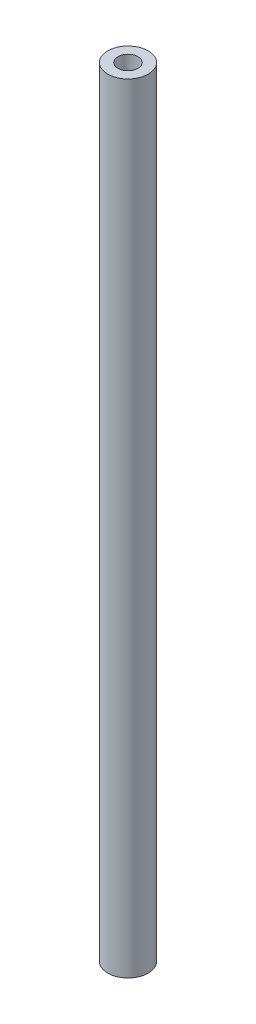
ISO-10303-21;
HEADER;
FILE_DESCRIPTION(('STEP AP214'),'2;1');
FILE_NAME('part.step','',(''),(''),'','','');
FILE_SCHEMA(('AUTOMOTIVE_DESIGN { 1 0 10303 214 1 1 1 1 }'));
ENDSEC;
DATA;
#1=APPLICATION_CONTEXT('core data for automotive mechanical design processes');
#2=APPLICATION_PROTOCOL_DEFINITION('international standard','automotive_design',2000,#1);
#3=PRODUCT_CONTEXT('',#1,'mechanical');
#4=PRODUCT('Part','Part','',(#3));
#5=PRODUCT_RELATED_PRODUCT_CATEGORY('part','',(#4));
#6=PRODUCT_DEFINITION_FORMATION('','',#4);
#7=PRODUCT_DEFINITION_CONTEXT('part definition',#1,'design');
#8=PRODUCT_DEFINITION('design','',#6,#7);
#9=PRODUCT_DEFINITION_SHAPE('','',#8);
#10=(LENGTH_UNIT() NAMED_UNIT(*) SI_UNIT(.MILLI.,.METRE.));
#11=(NAMED_UNIT(*) PLANE_ANGLE_UNIT() SI_UNIT($,.RADIAN.));
#12=(NAMED_UNIT(*) SI_UNIT($,.STERADIAN.) SOLID_ANGLE_UNIT());
#13=UNCERTAINTY_MEASURE_WITH_UNIT(LENGTH_MEASURE(1.E-05),#10,'distance_accuracy_value','');
#14=(GEOMETRIC_REPRESENTATION_CONTEXT(3) GLOBAL_UNCERTAINTY_ASSIGNED_CONTEXT((#13)) GLOBAL_UNIT_ASSIGNED_CONTEXT((#10,
#11,#12)) REPRESENTATION_CONTEXT('',''));
#15=CARTESIAN_POINT('',(0.,0.,0.));
#16=DIRECTION('',(0.,0.,1.));
#17=DIRECTION('',(1.,0.,0.));
#18=AXIS2_PLACEMENT_3D('',#15,#16,#17);
#19=CARTESIAN_POINT('',(0.,367.03,0.));
#20=DIRECTION('',(0.,1.,0.));
#21=DIRECTION('',(0.,0.,1.));
#22=AXIS2_PLACEMENT_3D('',#19,#20,#21);
#23=PLANE('',#22);
#24=CARTESIAN_POINT('',(0.,367.03,0.));
#25=DIRECTION('',(0.,1.,0.));
#26=DIRECTION('',(0.,0.,1.));
#27=AXIS2_PLACEMENT_3D('',#24,#25,#26);
#28=CIRCLE('',#27,9.525);
#29=CARTESIAN_POINT('',(0.,367.03,9.525));
#30=VERTEX_POINT('',#29);
#31=EDGE_CURVE('E10',#30,#30,#28,.T.);
#32=ORIENTED_EDGE('',*,*,#31,.T.);
#33=EDGE_LOOP('',(#32));
#34=FACE_BOUND('',#33,.T.);
#35=CARTESIAN_POINT('',(0.,367.03,0.));
#36=DIRECTION('',(0.,1.,0.));
#37=DIRECTION('',(0.,0.,1.));
#38=AXIS2_PLACEMENT_3D('',#35,#36,#37);
#39=CIRCLE('',#38,4.7625);
#40=CARTESIAN_POINT('',(0.,367.03,4.7625));
#41=VERTEX_POINT('',#40);
#42=EDGE_CURVE('E42',#41,#41,#39,.T.);
#43=ORIENTED_EDGE('',*,*,#42,.F.);
#44=EDGE_LOOP('',(#43));
#45=FACE_BOUND('',#44,.T.);
#46=ADVANCED_FACE('F31',(#34,#45),#23,.T.);
#47=CARTESIAN_POINT('',(0.,0.,0.));
#48=DIRECTION('',(0.,1.,0.));
#49=DIRECTION('',(0.,0.,1.));
#50=AXIS2_PLACEMENT_3D('',#47,#48,#49);
#51=PLANE('',#50);
#52=CARTESIAN_POINT('',(0.,0.,0.));
#53=DIRECTION('',(0.,1.,0.));
#54=DIRECTION('',(0.,0.,1.));
#55=AXIS2_PLACEMENT_3D('',#52,#53,#54);
#56=CIRCLE('',#55,9.525);
#57=CARTESIAN_POINT('',(0.,0.,9.525));
#58=VERTEX_POINT('',#57);
#59=EDGE_CURVE('E35',#58,#58,#56,.T.);
#60=ORIENTED_EDGE('',*,*,#59,.F.);
#61=EDGE_LOOP('',(#60));
#62=FACE_BOUND('',#61,.T.);
#63=CARTESIAN_POINT('',(0.,0.,0.));
#64=DIRECTION('',(0.,1.,0.));
#65=DIRECTION('',(0.,0.,1.));
#66=AXIS2_PLACEMENT_3D('',#63,#64,#65);
#67=CIRCLE('',#66,4.7625);
#68=CARTESIAN_POINT('',(0.,0.,4.7625));
#69=VERTEX_POINT('',#68);
#70=EDGE_CURVE('E44',#69,#69,#67,.T.);
#71=ORIENTED_EDGE('',*,*,#70,.T.);
#72=EDGE_LOOP('',(#71));
#73=FACE_BOUND('',#72,.T.);
#74=ADVANCED_FACE('F54',(#62,#73),#51,.F.);
#75=CARTESIAN_POINT('',(0.,367.03,0.));
#76=DIRECTION('',(0.,-1.,0.));
#77=DIRECTION('',(0.,0.,-1.));
#78=AXIS2_PLACEMENT_3D('',#75,#76,#77);
#79=CYLINDRICAL_SURFACE('',#78,9.525);
#80=ORIENTED_EDGE('',*,*,#31,.F.);
#81=EDGE_LOOP('',(#80));
#82=FACE_BOUND('',#81,.T.);
#83=ORIENTED_EDGE('',*,*,#59,.T.);
#84=EDGE_LOOP('',(#83));
#85=FACE_BOUND('',#84,.T.);
#86=ADVANCED_FACE('F33',(#82,#85),#79,.T.);
#87=CARTESIAN_POINT('',(0.,367.03,0.));
#88=DIRECTION('',(0.,-1.,0.));
#89=DIRECTION('',(0.,0.,-1.));
#90=AXIS2_PLACEMENT_3D('',#87,#88,#89);
#91=CYLINDRICAL_SURFACE('',#90,4.7625);
#92=ORIENTED_EDGE('',*,*,#42,.T.);
#93=EDGE_LOOP('',(#92));
#94=FACE_BOUND('',#93,.T.);
#95=ORIENTED_EDGE('',*,*,#70,.F.);
#96=EDGE_LOOP('',(#95));
#97=FACE_BOUND('',#96,.T.);
#98=ADVANCED_FACE('F50',(#94,#97),#91,.F.);
#99=CLOSED_SHELL('',(#46,#74,#86,#98));
#100=MANIFOLD_SOLID_BREP('B2',#99);
#101=ADVANCED_BREP_SHAPE_REPRESENTATION('',(#18,#100),#14);
#102=SHAPE_DEFINITION_REPRESENTATION(#9,#101);
ENDSEC;
END-ISO-10303-21;
